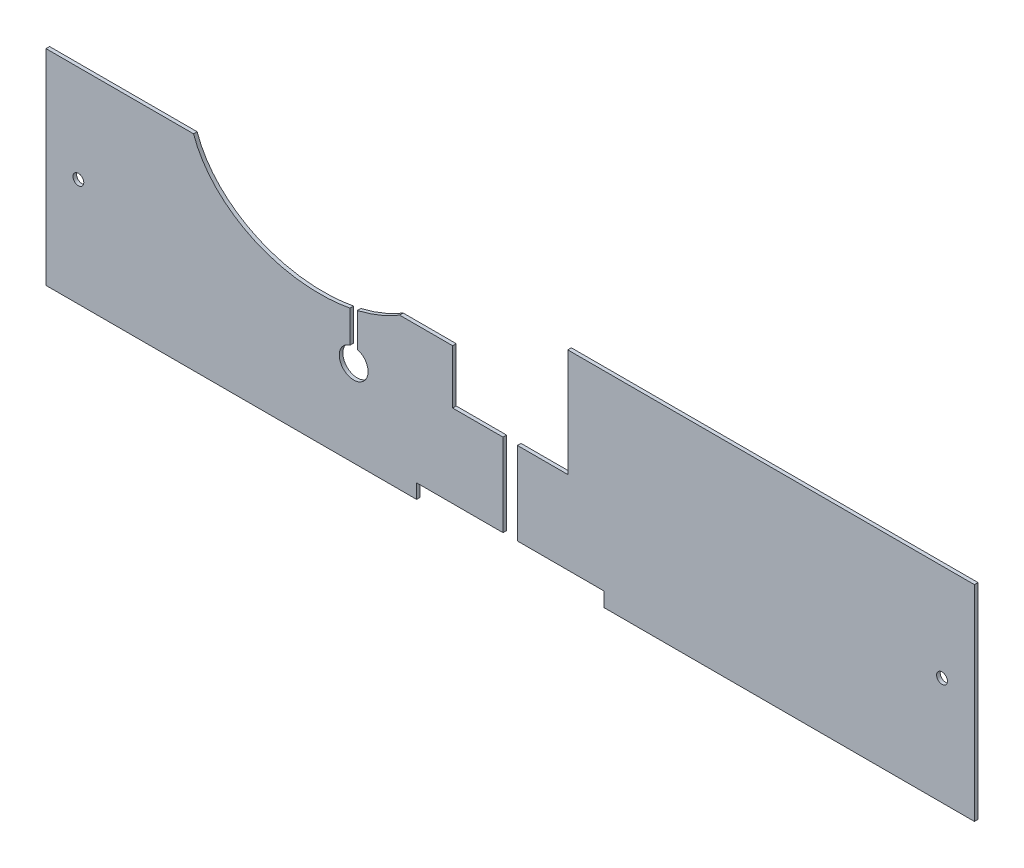
ISO-10303-21;
HEADER;
FILE_DESCRIPTION(('STEP AP214'),'2;1');
FILE_NAME('part.step','',(''),(''),'','','');
FILE_SCHEMA(('AUTOMOTIVE_DESIGN { 1 0 10303 214 1 1 1 1 }'));
ENDSEC;
DATA;
#1=APPLICATION_CONTEXT('core data for automotive mechanical design processes');
#2=APPLICATION_PROTOCOL_DEFINITION('international standard','automotive_design',2000,#1);
#3=PRODUCT_CONTEXT('',#1,'mechanical');
#4=PRODUCT('Part','Part','',(#3));
#5=PRODUCT_RELATED_PRODUCT_CATEGORY('part','',(#4));
#6=PRODUCT_DEFINITION_FORMATION('','',#4);
#7=PRODUCT_DEFINITION_CONTEXT('part definition',#1,'design');
#8=PRODUCT_DEFINITION('design','',#6,#7);
#9=PRODUCT_DEFINITION_SHAPE('','',#8);
#10=(LENGTH_UNIT() NAMED_UNIT(*) SI_UNIT(.MILLI.,.METRE.));
#11=(NAMED_UNIT(*) PLANE_ANGLE_UNIT() SI_UNIT($,.RADIAN.));
#12=(NAMED_UNIT(*) SI_UNIT($,.STERADIAN.) SOLID_ANGLE_UNIT());
#13=UNCERTAINTY_MEASURE_WITH_UNIT(LENGTH_MEASURE(1.E-05),#10,'distance_accuracy_value','');
#14=(GEOMETRIC_REPRESENTATION_CONTEXT(3) GLOBAL_UNCERTAINTY_ASSIGNED_CONTEXT((#13)) GLOBAL_UNIT_ASSIGNED_CONTEXT((#10,
#11,#12)) REPRESENTATION_CONTEXT('',''));
#15=CARTESIAN_POINT('',(0.,0.,0.));
#16=DIRECTION('',(0.,0.,1.));
#17=DIRECTION('',(1.,0.,0.));
#18=AXIS2_PLACEMENT_3D('',#15,#16,#17);
#19=CARTESIAN_POINT('',(-53.,7.5,-1.));
#20=DIRECTION('',(0.,0.,1.));
#21=DIRECTION('',(1.,0.,0.));
#22=AXIS2_PLACEMENT_3D('',#19,#20,#21);
#23=ELLIPSE('',#22,36.2787242517337,28.5);
#24=DIRECTION('',(0.,0.,-1.));
#25=VECTOR('',#24,1.);
#26=SURFACE_OF_LINEAR_EXTRUSION('',#23,#25);
#27=DIRECTION('',(0.,0.,-1.));
#28=VECTOR('',#27,1.);
#29=CARTESIAN_POINT('',(-44.5,-20.2067036756708,-1.));
#30=LINE('',#29,#28);
#31=CARTESIAN_POINT('',(-44.5,-20.2067036756708,-1.));
#32=VERTEX_POINT('',#31);
#33=CARTESIAN_POINT('',(-44.5,-20.2067036756708,0.));
#34=VERTEX_POINT('',#33);
#35=EDGE_CURVE('E392',#32,#34,#30,.F.);
#36=ORIENTED_EDGE('',*,*,#35,.F.);
#37=CARTESIAN_POINT('',(-53.,7.5,-1.));
#38=DIRECTION('',(0.,0.,1.));
#39=DIRECTION('',(1.,0.,0.));
#40=AXIS2_PLACEMENT_3D('',#37,#38,#39);
#41=ELLIPSE('',#40,36.2787242517337,28.5);
#42=CARTESIAN_POINT('',(-88.,0.,-1.));
#43=VERTEX_POINT('',#42);
#44=EDGE_CURVE('E172',#43,#32,#41,.T.);
#45=ORIENTED_EDGE('',*,*,#44,.F.);
#46=DIRECTION('',(0.,0.,-1.));
#47=VECTOR('',#46,1.);
#48=CARTESIAN_POINT('',(-88.,0.,-1.));
#49=LINE('',#48,#47);
#50=CARTESIAN_POINT('',(-88.,0.,0.));
#51=VERTEX_POINT('',#50);
#52=EDGE_CURVE('E406',#43,#51,#49,.F.);
#53=ORIENTED_EDGE('',*,*,#52,.T.);
#54=CARTESIAN_POINT('',(-53.,7.5,0.));
#55=DIRECTION('',(0.,0.,1.));
#56=DIRECTION('',(1.,0.,0.));
#57=AXIS2_PLACEMENT_3D('',#54,#55,#56);
#58=ELLIPSE('',#57,36.2787242517337,28.5);
#59=EDGE_CURVE('E184',#51,#34,#58,.T.);
#60=ORIENTED_EDGE('',*,*,#59,.T.);
#61=EDGE_LOOP('',(#36,#45,#53,#60));
#62=FACE_BOUND('',#61,.T.);
#63=ADVANCED_FACE('F49',(#62),#26,.T.);
#64=CARTESIAN_POINT('',(-26.,-53.,-1.));
#65=DIRECTION('',(0.,-1.,0.));
#66=DIRECTION('',(0.,0.,-1.));
#67=AXIS2_PLACEMENT_3D('',#64,#65,#66);
#68=PLANE('',#67);
#69=DIRECTION('',(0.,0.,1.));
#70=VECTOR('',#69,1.);
#71=CARTESIAN_POINT('',(-1.99999999999999,-53.,-1.));
#72=LINE('',#71,#70);
#73=CARTESIAN_POINT('',(-1.99999999999999,-53.,-1.));
#74=VERTEX_POINT('',#73);
#75=CARTESIAN_POINT('',(-1.99999999999999,-53.,0.));
#76=VERTEX_POINT('',#75);
#77=EDGE_CURVE('E395',#74,#76,#72,.T.);
#78=ORIENTED_EDGE('',*,*,#77,.T.);
#79=DIRECTION('',(1.,0.,0.));
#80=VECTOR('',#79,1.);
#81=CARTESIAN_POINT('',(-26.,-53.,0.));
#82=LINE('',#81,#80);
#83=CARTESIAN_POINT('',(-26.,-53.,0.));
#84=VERTEX_POINT('',#83);
#85=EDGE_CURVE('E191',#84,#76,#82,.T.);
#86=ORIENTED_EDGE('',*,*,#85,.F.);
#87=DIRECTION('',(0.,0.,1.));
#88=VECTOR('',#87,1.);
#89=CARTESIAN_POINT('',(-26.,-53.,-1.));
#90=LINE('',#89,#88);
#91=CARTESIAN_POINT('',(-26.,-53.,-1.));
#92=VERTEX_POINT('',#91);
#93=EDGE_CURVE('E419',#92,#84,#90,.T.);
#94=ORIENTED_EDGE('',*,*,#93,.F.);
#95=DIRECTION('',(1.,0.,0.));
#96=VECTOR('',#95,1.);
#97=CARTESIAN_POINT('',(-26.,-53.,-1.));
#98=LINE('',#97,#96);
#99=EDGE_CURVE('E178',#92,#74,#98,.T.);
#100=ORIENTED_EDGE('',*,*,#99,.T.);
#101=EDGE_LOOP('',(#78,#86,#94,#100));
#102=FACE_BOUND('',#101,.T.);
#103=ADVANCED_FACE('F51',(#102),#68,.T.);
#104=CARTESIAN_POINT('',(0.,0.,-1.));
#105=DIRECTION('',(0.,0.,-1.));
#106=DIRECTION('',(-1.,0.,0.));
#107=AXIS2_PLACEMENT_3D('',#104,#105,#106);
#108=PLANE('',#107);
#109=DIRECTION('',(1.,0.,0.));
#110=VECTOR('',#109,1.);
#111=CARTESIAN_POINT('',(-16.,-15.,-1.));
#112=LINE('',#111,#110);
#113=CARTESIAN_POINT('',(-30.7326846401877,-15.,-1.));
#114=VERTEX_POINT('',#113);
#115=CARTESIAN_POINT('',(-16.,-15.,-1.));
#116=VERTEX_POINT('',#115);
#117=EDGE_CURVE('E148',#114,#116,#112,.T.);
#118=ORIENTED_EDGE('',*,*,#117,.T.);
#119=DIRECTION('',(0.,1.,0.));
#120=VECTOR('',#119,1.);
#121=CARTESIAN_POINT('',(-16.,0.,-1.));
#122=LINE('',#121,#120);
#123=CARTESIAN_POINT('',(-16.,-30.,-1.));
#124=VERTEX_POINT('',#123);
#125=EDGE_CURVE('E176',#116,#124,#122,.F.);
#126=ORIENTED_EDGE('',*,*,#125,.T.);
#127=DIRECTION('',(-1.,0.,0.));
#128=VECTOR('',#127,1.);
#129=CARTESIAN_POINT('',(0.,-30.,-1.));
#130=LINE('',#129,#128);
#131=CARTESIAN_POINT('',(-2.,-30.,-1.));
#132=VERTEX_POINT('',#131);
#133=EDGE_CURVE('E457',#124,#132,#130,.F.);
#134=ORIENTED_EDGE('',*,*,#133,.T.);
#135=DIRECTION('',(0.,-1.,0.));
#136=VECTOR('',#135,1.);
#137=CARTESIAN_POINT('',(-2.,0.,-1.));
#138=LINE('',#137,#136);
#139=EDGE_CURVE('E173',#132,#74,#138,.T.);
#140=ORIENTED_EDGE('',*,*,#139,.T.);
#141=ORIENTED_EDGE('',*,*,#99,.F.);
#142=DIRECTION('',(0.,1.,0.));
#143=VECTOR('',#142,1.);
#144=CARTESIAN_POINT('',(-26.,-57.,-1.));
#145=LINE('',#144,#143);
#146=CARTESIAN_POINT('',(-26.,-57.,-1.));
#147=VERTEX_POINT('',#146);
#148=EDGE_CURVE('E420',#147,#92,#145,.T.);
#149=ORIENTED_EDGE('',*,*,#148,.F.);
#150=DIRECTION('',(1.,0.,0.));
#151=VECTOR('',#150,1.);
#152=CARTESIAN_POINT('',(-129.,-57.,-1.));
#153=LINE('',#152,#151);
#154=CARTESIAN_POINT('',(-129.,-57.,-1.));
#155=VERTEX_POINT('',#154);
#156=EDGE_CURVE('E409',#155,#147,#153,.T.);
#157=ORIENTED_EDGE('',*,*,#156,.F.);
#158=DIRECTION('',(0.,-1.,0.));
#159=VECTOR('',#158,1.);
#160=CARTESIAN_POINT('',(-129.,-57.,-1.));
#161=LINE('',#160,#159);
#162=CARTESIAN_POINT('',(-129.,0.,-1.));
#163=VERTEX_POINT('',#162);
#164=EDGE_CURVE('E412',#163,#155,#161,.T.);
#165=ORIENTED_EDGE('',*,*,#164,.F.);
#166=DIRECTION('',(-1.,0.,0.));
#167=VECTOR('',#166,1.);
#168=CARTESIAN_POINT('',(-129.,0.,-1.));
#169=LINE('',#168,#167);
#170=EDGE_CURVE('E436',#43,#163,#169,.T.);
#171=ORIENTED_EDGE('',*,*,#170,.F.);
#172=ORIENTED_EDGE('',*,*,#44,.T.);
#173=DIRECTION('',(0.,-1.,0.));
#174=VECTOR('',#173,1.);
#175=CARTESIAN_POINT('',(-44.5,-19.7802126091422,-1.));
#176=LINE('',#175,#174);
#177=CARTESIAN_POINT('',(-44.5,-29.1270166537926,-1.));
#178=VERTEX_POINT('',#177);
#179=EDGE_CURVE('E394',#32,#178,#176,.T.);
#180=ORIENTED_EDGE('',*,*,#179,.T.);
#181=CARTESIAN_POINT('',(-43.5,-33.,-1.));
#182=DIRECTION('',(0.,0.,1.));
#183=DIRECTION('',(-1.,0.,0.));
#184=AXIS2_PLACEMENT_3D('',#181,#182,#183);
#185=ELLIPSE('',#184,4.,4.);
#186=CARTESIAN_POINT('',(-42.5,-29.1270166537926,-1.));
#187=VERTEX_POINT('',#186);
#188=EDGE_CURVE('E192',#178,#187,#185,.T.);
#189=ORIENTED_EDGE('',*,*,#188,.T.);
#190=DIRECTION('',(0.,1.,0.));
#191=VECTOR('',#190,1.);
#192=CARTESIAN_POINT('',(-42.5,-19.7802126091422,-1.));
#193=LINE('',#192,#191);
#194=CARTESIAN_POINT('',(-42.5,-19.7802126091422,-1.));
#195=VERTEX_POINT('',#194);
#196=EDGE_CURVE('E63',#187,#195,#193,.T.);
#197=ORIENTED_EDGE('',*,*,#196,.T.);
#198=EDGE_CURVE('E165',#195,#114,#41,.T.);
#199=ORIENTED_EDGE('',*,*,#198,.T.);
#200=EDGE_LOOP('',(#118,#126,#134,#140,#141,#149,#157,#165,#171,#172,#180,#189,#197,#199));
#201=FACE_BOUND('',#200,.T.);
#202=CARTESIAN_POINT('',(-120.,-27.,-1.));
#203=DIRECTION('',(0.,0.,1.));
#204=DIRECTION('',(1.,0.,0.));
#205=AXIS2_PLACEMENT_3D('',#202,#203,#204);
#206=CIRCLE('',#205,1.5);
#207=CARTESIAN_POINT('',(-118.5,-27.,-1.));
#208=VERTEX_POINT('',#207);
#209=EDGE_CURVE('E188',#208,#208,#206,.T.);
#210=ORIENTED_EDGE('',*,*,#209,.T.);
#211=EDGE_LOOP('',(#210));
#212=FACE_BOUND('',#211,.T.);
#213=ADVANCED_FACE('F169',(#201,#212),#108,.T.);
#214=CARTESIAN_POINT('',(0.,0.,0.));
#215=DIRECTION('',(0.,0.,-1.));
#216=DIRECTION('',(-1.,0.,0.));
#217=AXIS2_PLACEMENT_3D('',#214,#215,#216);
#218=PLANE('',#217);
#219=DIRECTION('',(0.,-1.,0.));
#220=VECTOR('',#219,1.);
#221=CARTESIAN_POINT('',(-16.,0.,0.));
#222=LINE('',#221,#220);
#223=CARTESIAN_POINT('',(-16.,-15.,0.));
#224=VERTEX_POINT('',#223);
#225=CARTESIAN_POINT('',(-16.,-30.,0.));
#226=VERTEX_POINT('',#225);
#227=EDGE_CURVE('E448',#224,#226,#222,.T.);
#228=ORIENTED_EDGE('',*,*,#227,.F.);
#229=DIRECTION('',(1.,0.,0.));
#230=VECTOR('',#229,1.);
#231=CARTESIAN_POINT('',(-16.,-15.,0.));
#232=LINE('',#231,#230);
#233=CARTESIAN_POINT('',(-30.7326846401877,-15.,0.));
#234=VERTEX_POINT('',#233);
#235=EDGE_CURVE('E158',#234,#224,#232,.T.);
#236=ORIENTED_EDGE('',*,*,#235,.F.);
#237=CARTESIAN_POINT('',(-42.5,-19.7802126091422,0.));
#238=VERTEX_POINT('',#237);
#239=EDGE_CURVE('E167',#238,#234,#58,.T.);
#240=ORIENTED_EDGE('',*,*,#239,.F.);
#241=DIRECTION('',(0.,1.,0.));
#242=VECTOR('',#241,1.);
#243=CARTESIAN_POINT('',(-42.5,-19.7802126091422,0.));
#244=LINE('',#243,#242);
#245=CARTESIAN_POINT('',(-42.5,-29.1270166537926,0.));
#246=VERTEX_POINT('',#245);
#247=EDGE_CURVE('E403',#246,#238,#244,.T.);
#248=ORIENTED_EDGE('',*,*,#247,.F.);
#249=CARTESIAN_POINT('',(-43.5,-33.,0.));
#250=DIRECTION('',(0.,0.,1.));
#251=DIRECTION('',(-1.,0.,0.));
#252=AXIS2_PLACEMENT_3D('',#249,#250,#251);
#253=ELLIPSE('',#252,4.,4.);
#254=CARTESIAN_POINT('',(-44.5,-29.1270166537926,0.));
#255=VERTEX_POINT('',#254);
#256=EDGE_CURVE('E187',#255,#246,#253,.T.);
#257=ORIENTED_EDGE('',*,*,#256,.F.);
#258=DIRECTION('',(0.,-1.,0.));
#259=VECTOR('',#258,1.);
#260=CARTESIAN_POINT('',(-44.5,-19.7802126091422,0.));
#261=LINE('',#260,#259);
#262=EDGE_CURVE('E71',#34,#255,#261,.T.);
#263=ORIENTED_EDGE('',*,*,#262,.F.);
#264=ORIENTED_EDGE('',*,*,#59,.F.);
#265=DIRECTION('',(-1.,0.,0.));
#266=VECTOR('',#265,1.);
#267=CARTESIAN_POINT('',(-129.,0.,0.));
#268=LINE('',#267,#266);
#269=CARTESIAN_POINT('',(-129.,0.,0.));
#270=VERTEX_POINT('',#269);
#271=EDGE_CURVE('E427',#51,#270,#268,.T.);
#272=ORIENTED_EDGE('',*,*,#271,.T.);
#273=DIRECTION('',(0.,-1.,0.));
#274=VECTOR('',#273,1.);
#275=CARTESIAN_POINT('',(-129.,-57.,0.));
#276=LINE('',#275,#274);
#277=CARTESIAN_POINT('',(-129.,-57.,0.));
#278=VERTEX_POINT('',#277);
#279=EDGE_CURVE('E423',#270,#278,#276,.T.);
#280=ORIENTED_EDGE('',*,*,#279,.T.);
#281=DIRECTION('',(1.,0.,0.));
#282=VECTOR('',#281,1.);
#283=CARTESIAN_POINT('',(-129.,-57.,0.));
#284=LINE('',#283,#282);
#285=CARTESIAN_POINT('',(-26.,-57.,0.));
#286=VERTEX_POINT('',#285);
#287=EDGE_CURVE('E426',#278,#286,#284,.T.);
#288=ORIENTED_EDGE('',*,*,#287,.T.);
#289=DIRECTION('',(0.,1.,0.));
#290=VECTOR('',#289,1.);
#291=CARTESIAN_POINT('',(-26.,-57.,0.));
#292=LINE('',#291,#290);
#293=EDGE_CURVE('E430',#286,#84,#292,.T.);
#294=ORIENTED_EDGE('',*,*,#293,.T.);
#295=ORIENTED_EDGE('',*,*,#85,.T.);
#296=DIRECTION('',(0.,-1.,0.));
#297=VECTOR('',#296,1.);
#298=CARTESIAN_POINT('',(-2.,0.,0.));
#299=LINE('',#298,#297);
#300=CARTESIAN_POINT('',(-2.,-30.,0.));
#301=VERTEX_POINT('',#300);
#302=EDGE_CURVE('E439',#301,#76,#299,.T.);
#303=ORIENTED_EDGE('',*,*,#302,.F.);
#304=DIRECTION('',(1.,0.,0.));
#305=VECTOR('',#304,1.);
#306=CARTESIAN_POINT('',(16.,-30.,0.));
#307=LINE('',#306,#305);
#308=EDGE_CURVE('E433',#226,#301,#307,.T.);
#309=ORIENTED_EDGE('',*,*,#308,.F.);
#310=EDGE_LOOP('',(#228,#236,#240,#248,#257,#263,#264,#272,#280,#288,#294,#295,#303,#309));
#311=FACE_BOUND('',#310,.T.);
#312=CARTESIAN_POINT('',(-120.,-27.,0.));
#313=DIRECTION('',(0.,0.,1.));
#314=DIRECTION('',(1.,0.,0.));
#315=AXIS2_PLACEMENT_3D('',#312,#313,#314);
#316=CIRCLE('',#315,1.5);
#317=CARTESIAN_POINT('',(-118.5,-27.,0.));
#318=VERTEX_POINT('',#317);
#319=EDGE_CURVE('E193',#318,#318,#316,.T.);
#320=ORIENTED_EDGE('',*,*,#319,.F.);
#321=EDGE_LOOP('',(#320));
#322=FACE_BOUND('',#321,.T.);
#323=ADVANCED_FACE('F225',(#311,#322),#218,.F.);
#324=CARTESIAN_POINT('',(16.,-30.,0.));
#325=DIRECTION('',(0.,1.,0.));
#326=DIRECTION('',(1.,0.,0.));
#327=AXIS2_PLACEMENT_3D('',#324,#325,#326);
#328=PLANE('',#327);
#329=DIRECTION('',(0.,0.,1.));
#330=VECTOR('',#329,1.);
#331=CARTESIAN_POINT('',(-2.,-30.,0.));
#332=LINE('',#331,#330);
#333=EDGE_CURVE('E196',#132,#301,#332,.T.);
#334=ORIENTED_EDGE('',*,*,#333,.F.);
#335=ORIENTED_EDGE('',*,*,#133,.F.);
#336=DIRECTION('',(0.,0.,1.));
#337=VECTOR('',#336,1.);
#338=CARTESIAN_POINT('',(-16.,-30.,0.));
#339=LINE('',#338,#337);
#340=EDGE_CURVE('E197',#226,#124,#339,.F.);
#341=ORIENTED_EDGE('',*,*,#340,.F.);
#342=ORIENTED_EDGE('',*,*,#308,.T.);
#343=EDGE_LOOP('',(#334,#335,#341,#342));
#344=FACE_BOUND('',#343,.T.);
#345=ADVANCED_FACE('F221',(#344),#328,.T.);
#346=CARTESIAN_POINT('',(-129.,0.,-1.));
#347=DIRECTION('',(0.,1.,0.));
#348=DIRECTION('',(0.,0.,1.));
#349=AXIS2_PLACEMENT_3D('',#346,#347,#348);
#350=PLANE('',#349);
#351=ORIENTED_EDGE('',*,*,#271,.F.);
#352=ORIENTED_EDGE('',*,*,#52,.F.);
#353=ORIENTED_EDGE('',*,*,#170,.T.);
#354=DIRECTION('',(0.,0.,1.));
#355=VECTOR('',#354,1.);
#356=CARTESIAN_POINT('',(-129.,0.,-1.));
#357=LINE('',#356,#355);
#358=EDGE_CURVE('E416',#163,#270,#357,.T.);
#359=ORIENTED_EDGE('',*,*,#358,.T.);
#360=EDGE_LOOP('',(#351,#352,#353,#359));
#361=FACE_BOUND('',#360,.T.);
#362=ADVANCED_FACE('F217',(#361),#350,.T.);
#363=CARTESIAN_POINT('',(-129.,-57.,-1.));
#364=DIRECTION('',(-1.,0.,0.));
#365=DIRECTION('',(0.,0.,1.));
#366=AXIS2_PLACEMENT_3D('',#363,#364,#365);
#367=PLANE('',#366);
#368=ORIENTED_EDGE('',*,*,#279,.F.);
#369=ORIENTED_EDGE('',*,*,#358,.F.);
#370=ORIENTED_EDGE('',*,*,#164,.T.);
#371=DIRECTION('',(0.,0.,1.));
#372=VECTOR('',#371,1.);
#373=CARTESIAN_POINT('',(-129.,-57.,-1.));
#374=LINE('',#373,#372);
#375=EDGE_CURVE('E415',#155,#278,#374,.T.);
#376=ORIENTED_EDGE('',*,*,#375,.T.);
#377=EDGE_LOOP('',(#368,#369,#370,#376));
#378=FACE_BOUND('',#377,.T.);
#379=ADVANCED_FACE('F220',(#378),#367,.T.);
#380=CARTESIAN_POINT('',(-26.,-57.,-1.));
#381=DIRECTION('',(1.,0.,0.));
#382=DIRECTION('',(0.,0.,-1.));
#383=AXIS2_PLACEMENT_3D('',#380,#381,#382);
#384=PLANE('',#383);
#385=ORIENTED_EDGE('',*,*,#293,.F.);
#386=DIRECTION('',(0.,0.,1.));
#387=VECTOR('',#386,1.);
#388=CARTESIAN_POINT('',(-26.,-57.,-1.));
#389=LINE('',#388,#387);
#390=EDGE_CURVE('E408',#147,#286,#389,.T.);
#391=ORIENTED_EDGE('',*,*,#390,.F.);
#392=ORIENTED_EDGE('',*,*,#148,.T.);
#393=ORIENTED_EDGE('',*,*,#93,.T.);
#394=EDGE_LOOP('',(#385,#391,#392,#393));
#395=FACE_BOUND('',#394,.T.);
#396=ADVANCED_FACE('F245',(#395),#384,.T.);
#397=CARTESIAN_POINT('',(-129.,-57.,-1.));
#398=DIRECTION('',(0.,-1.,0.));
#399=DIRECTION('',(0.,0.,-1.));
#400=AXIS2_PLACEMENT_3D('',#397,#398,#399);
#401=PLANE('',#400);
#402=ORIENTED_EDGE('',*,*,#287,.F.);
#403=ORIENTED_EDGE('',*,*,#375,.F.);
#404=ORIENTED_EDGE('',*,*,#156,.T.);
#405=ORIENTED_EDGE('',*,*,#390,.T.);
#406=EDGE_LOOP('',(#402,#403,#404,#405));
#407=FACE_BOUND('',#406,.T.);
#408=ADVANCED_FACE('F241',(#407),#401,.T.);
#409=DIRECTION('',(0.,0.,1.));
#410=VECTOR('',#409,1.);
#411=CARTESIAN_POINT('',(-30.7326846401877,-15.,-1.));
#412=LINE('',#411,#410);
#413=EDGE_CURVE('E151',#114,#234,#412,.T.);
#414=ORIENTED_EDGE('',*,*,#413,.F.);
#415=ORIENTED_EDGE('',*,*,#198,.F.);
#416=DIRECTION('',(0.,0.,1.));
#417=VECTOR('',#416,1.);
#418=CARTESIAN_POINT('',(-42.5,-19.7802126091422,-1.));
#419=LINE('',#418,#417);
#420=EDGE_CURVE('E441',#195,#238,#419,.T.);
#421=ORIENTED_EDGE('',*,*,#420,.T.);
#422=ORIENTED_EDGE('',*,*,#239,.T.);
#423=EDGE_LOOP('',(#414,#415,#421,#422));
#424=FACE_BOUND('',#423,.T.);
#425=ADVANCED_FACE('F163',(#424),#26,.T.);
#426=CARTESIAN_POINT('',(-43.5,-33.,-1.));
#427=DIRECTION('',(0.,0.,1.));
#428=DIRECTION('',(-1.,0.,0.));
#429=AXIS2_PLACEMENT_3D('',#426,#427,#428);
#430=ELLIPSE('',#429,4.,4.);
#431=DIRECTION('',(0.,0.,-1.));
#432=VECTOR('',#431,1.);
#433=SURFACE_OF_LINEAR_EXTRUSION('',#430,#432);
#434=DIRECTION('',(0.,0.,-1.));
#435=VECTOR('',#434,1.);
#436=CARTESIAN_POINT('',(-42.5,-29.1270166537926,-1.));
#437=LINE('',#436,#435);
#438=EDGE_CURVE('E12',#187,#246,#437,.F.);
#439=ORIENTED_EDGE('',*,*,#438,.F.);
#440=ORIENTED_EDGE('',*,*,#188,.F.);
#441=DIRECTION('',(0.,0.,-1.));
#442=VECTOR('',#441,1.);
#443=CARTESIAN_POINT('',(-44.5,-29.1270166537926,-1.));
#444=LINE('',#443,#442);
#445=EDGE_CURVE('E57',#255,#178,#444,.T.);
#446=ORIENTED_EDGE('',*,*,#445,.F.);
#447=ORIENTED_EDGE('',*,*,#256,.T.);
#448=EDGE_LOOP('',(#439,#440,#446,#447));
#449=FACE_BOUND('',#448,.T.);
#450=ADVANCED_FACE('F202',(#449),#433,.T.);
#451=CARTESIAN_POINT('',(-16.,0.,0.));
#452=DIRECTION('',(1.,0.,0.));
#453=DIRECTION('',(0.,-1.,0.));
#454=AXIS2_PLACEMENT_3D('',#451,#452,#453);
#455=PLANE('',#454);
#456=DIRECTION('',(0.,0.,1.));
#457=VECTOR('',#456,1.);
#458=CARTESIAN_POINT('',(-16.,-15.,-1.));
#459=LINE('',#458,#457);
#460=EDGE_CURVE('E154',#116,#224,#459,.T.);
#461=ORIENTED_EDGE('',*,*,#460,.T.);
#462=ORIENTED_EDGE('',*,*,#227,.T.);
#463=ORIENTED_EDGE('',*,*,#340,.T.);
#464=ORIENTED_EDGE('',*,*,#125,.F.);
#465=EDGE_LOOP('',(#461,#462,#463,#464));
#466=FACE_BOUND('',#465,.T.);
#467=ADVANCED_FACE('F206',(#466),#455,.T.);
#468=CARTESIAN_POINT('',(-120.,-27.,-1.));
#469=DIRECTION('',(0.,0.,-1.));
#470=DIRECTION('',(-1.,0.,0.));
#471=AXIS2_PLACEMENT_3D('',#468,#469,#470);
#472=CYLINDRICAL_SURFACE('',#471,1.5);
#473=ORIENTED_EDGE('',*,*,#319,.T.);
#474=EDGE_LOOP('',(#473));
#475=FACE_BOUND('',#474,.T.);
#476=ORIENTED_EDGE('',*,*,#209,.F.);
#477=EDGE_LOOP('',(#476));
#478=FACE_BOUND('',#477,.T.);
#479=ADVANCED_FACE('F208',(#475,#478),#472,.F.);
#480=CARTESIAN_POINT('',(-2.,0.,-1.));
#481=DIRECTION('',(-1.,0.,0.));
#482=DIRECTION('',(0.,-1.,0.));
#483=AXIS2_PLACEMENT_3D('',#480,#481,#482);
#484=PLANE('',#483);
#485=ORIENTED_EDGE('',*,*,#333,.T.);
#486=ORIENTED_EDGE('',*,*,#302,.T.);
#487=ORIENTED_EDGE('',*,*,#77,.F.);
#488=ORIENTED_EDGE('',*,*,#139,.F.);
#489=EDGE_LOOP('',(#485,#486,#487,#488));
#490=FACE_BOUND('',#489,.T.);
#491=ADVANCED_FACE('F213',(#490),#484,.F.);
#492=CARTESIAN_POINT('',(-16.,-15.,-1.));
#493=DIRECTION('',(0.,-1.,0.));
#494=DIRECTION('',(1.,0.,0.));
#495=AXIS2_PLACEMENT_3D('',#492,#493,#494);
#496=PLANE('',#495);
#497=ORIENTED_EDGE('',*,*,#235,.T.);
#498=ORIENTED_EDGE('',*,*,#460,.F.);
#499=ORIENTED_EDGE('',*,*,#117,.F.);
#500=ORIENTED_EDGE('',*,*,#413,.T.);
#501=EDGE_LOOP('',(#497,#498,#499,#500));
#502=FACE_BOUND('',#501,.T.);
#503=ADVANCED_FACE('F150',(#502),#496,.F.);
#504=CARTESIAN_POINT('',(-44.5,-19.7802126091422,-1.));
#505=DIRECTION('',(-1.,0.,0.));
#506=DIRECTION('',(0.,0.,1.));
#507=AXIS2_PLACEMENT_3D('',#504,#505,#506);
#508=PLANE('',#507);
#509=ORIENTED_EDGE('',*,*,#35,.T.);
#510=ORIENTED_EDGE('',*,*,#262,.T.);
#511=ORIENTED_EDGE('',*,*,#445,.T.);
#512=ORIENTED_EDGE('',*,*,#179,.F.);
#513=EDGE_LOOP('',(#509,#510,#511,#512));
#514=FACE_BOUND('',#513,.T.);
#515=ADVANCED_FACE('F260',(#514),#508,.F.);
#516=CARTESIAN_POINT('',(-42.5,-19.7802126091422,-1.));
#517=DIRECTION('',(1.,0.,0.));
#518=DIRECTION('',(0.,1.,0.));
#519=AXIS2_PLACEMENT_3D('',#516,#517,#518);
#520=PLANE('',#519);
#521=ORIENTED_EDGE('',*,*,#438,.T.);
#522=ORIENTED_EDGE('',*,*,#247,.T.);
#523=ORIENTED_EDGE('',*,*,#420,.F.);
#524=ORIENTED_EDGE('',*,*,#196,.F.);
#525=EDGE_LOOP('',(#521,#522,#523,#524));
#526=FACE_BOUND('',#525,.T.);
#527=ADVANCED_FACE('F257',(#526),#520,.F.);
#528=CLOSED_SHELL('',(#63,#103,#213,#323,#345,#362,#379,#396,#408,#425,#450,#467,#479,#491,#503,
#515,#527));
#529=MANIFOLD_SOLID_BREP('B2',#528);
#530=CARTESIAN_POINT('',(-129.,0.,-1.));
#531=DIRECTION('',(0.,1.,0.));
#532=DIRECTION('',(0.,0.,1.));
#533=AXIS2_PLACEMENT_3D('',#530,#531,#532);
#534=PLANE('',#533);
#535=DIRECTION('',(-1.,0.,0.));
#536=VECTOR('',#535,1.);
#537=CARTESIAN_POINT('',(-129.,0.,-1.));
#538=LINE('',#537,#536);
#539=CARTESIAN_POINT('',(129.,0.,-1.));
#540=VERTEX_POINT('',#539);
#541=CARTESIAN_POINT('',(16.,0.,-1.));
#542=VERTEX_POINT('',#541);
#543=EDGE_CURVE('E584',#540,#542,#538,.T.);
#544=ORIENTED_EDGE('',*,*,#543,.T.);
#545=DIRECTION('',(0.,0.,1.));
#546=VECTOR('',#545,1.);
#547=CARTESIAN_POINT('',(16.,0.,0.));
#548=LINE('',#547,#546);
#549=CARTESIAN_POINT('',(16.,0.,0.));
#550=VERTEX_POINT('',#549);
#551=EDGE_CURVE('E616',#550,#542,#548,.F.);
#552=ORIENTED_EDGE('',*,*,#551,.F.);
#553=DIRECTION('',(-1.,0.,0.));
#554=VECTOR('',#553,1.);
#555=CARTESIAN_POINT('',(-129.,0.,0.));
#556=LINE('',#555,#554);
#557=CARTESIAN_POINT('',(129.,0.,0.));
#558=VERTEX_POINT('',#557);
#559=EDGE_CURVE('E568',#558,#550,#556,.T.);
#560=ORIENTED_EDGE('',*,*,#559,.F.);
#561=DIRECTION('',(0.,0.,1.));
#562=VECTOR('',#561,1.);
#563=CARTESIAN_POINT('',(129.,0.,-1.));
#564=LINE('',#563,#562);
#565=EDGE_CURVE('E491',#540,#558,#564,.T.);
#566=ORIENTED_EDGE('',*,*,#565,.F.);
#567=EDGE_LOOP('',(#544,#552,#560,#566));
#568=FACE_BOUND('',#567,.T.);
#569=ADVANCED_FACE('F483',(#568),#534,.T.);
#570=CARTESIAN_POINT('',(129.,-57.,-1.));
#571=DIRECTION('',(1.,0.,0.));
#572=DIRECTION('',(0.,0.,-1.));
#573=AXIS2_PLACEMENT_3D('',#570,#571,#572);
#574=PLANE('',#573);
#575=DIRECTION('',(0.,1.,0.));
#576=VECTOR('',#575,1.);
#577=CARTESIAN_POINT('',(129.,-57.,0.));
#578=LINE('',#577,#576);
#579=CARTESIAN_POINT('',(129.,-57.,0.));
#580=VERTEX_POINT('',#579);
#581=EDGE_CURVE('E573',#580,#558,#578,.T.);
#582=ORIENTED_EDGE('',*,*,#581,.F.);
#583=DIRECTION('',(0.,0.,1.));
#584=VECTOR('',#583,1.);
#585=CARTESIAN_POINT('',(129.,-57.,-1.));
#586=LINE('',#585,#584);
#587=CARTESIAN_POINT('',(129.,-57.,-1.));
#588=VERTEX_POINT('',#587);
#589=EDGE_CURVE('E599',#588,#580,#586,.T.);
#590=ORIENTED_EDGE('',*,*,#589,.F.);
#591=DIRECTION('',(0.,1.,0.));
#592=VECTOR('',#591,1.);
#593=CARTESIAN_POINT('',(129.,-57.,-1.));
#594=LINE('',#593,#592);
#595=EDGE_CURVE('E581',#588,#540,#594,.T.);
#596=ORIENTED_EDGE('',*,*,#595,.T.);
#597=ORIENTED_EDGE('',*,*,#565,.T.);
#598=EDGE_LOOP('',(#582,#590,#596,#597));
#599=FACE_BOUND('',#598,.T.);
#600=ADVANCED_FACE('F642',(#599),#574,.T.);
#601=CARTESIAN_POINT('',(26.,-57.,-1.));
#602=DIRECTION('',(0.,-1.,0.));
#603=DIRECTION('',(0.,0.,-1.));
#604=AXIS2_PLACEMENT_3D('',#601,#602,#603);
#605=PLANE('',#604);
#606=DIRECTION('',(1.,0.,0.));
#607=VECTOR('',#606,1.);
#608=CARTESIAN_POINT('',(26.,-57.,0.));
#609=LINE('',#608,#607);
#610=CARTESIAN_POINT('',(26.,-57.,0.));
#611=VERTEX_POINT('',#610);
#612=EDGE_CURVE('E593',#611,#580,#609,.T.);
#613=ORIENTED_EDGE('',*,*,#612,.F.);
#614=DIRECTION('',(0.,0.,1.));
#615=VECTOR('',#614,1.);
#616=CARTESIAN_POINT('',(26.,-57.,-1.));
#617=LINE('',#616,#615);
#618=CARTESIAN_POINT('',(26.,-57.,-1.));
#619=VERTEX_POINT('',#618);
#620=EDGE_CURVE('E601',#619,#611,#617,.T.);
#621=ORIENTED_EDGE('',*,*,#620,.F.);
#622=DIRECTION('',(1.,0.,0.));
#623=VECTOR('',#622,1.);
#624=CARTESIAN_POINT('',(26.,-57.,-1.));
#625=LINE('',#624,#623);
#626=EDGE_CURVE('E570',#619,#588,#625,.T.);
#627=ORIENTED_EDGE('',*,*,#626,.T.);
#628=ORIENTED_EDGE('',*,*,#589,.T.);
#629=EDGE_LOOP('',(#613,#621,#627,#628));
#630=FACE_BOUND('',#629,.T.);
#631=ADVANCED_FACE('F638',(#630),#605,.T.);
#632=CARTESIAN_POINT('',(26.,-57.,-1.));
#633=DIRECTION('',(-1.,0.,0.));
#634=DIRECTION('',(0.,0.,1.));
#635=AXIS2_PLACEMENT_3D('',#632,#633,#634);
#636=PLANE('',#635);
#637=DIRECTION('',(0.,-1.,0.));
#638=VECTOR('',#637,1.);
#639=CARTESIAN_POINT('',(26.,-57.,0.));
#640=LINE('',#639,#638);
#641=CARTESIAN_POINT('',(26.,-53.,0.));
#642=VERTEX_POINT('',#641);
#643=EDGE_CURVE('E589',#642,#611,#640,.T.);
#644=ORIENTED_EDGE('',*,*,#643,.F.);
#645=DIRECTION('',(0.,0.,1.));
#646=VECTOR('',#645,1.);
#647=CARTESIAN_POINT('',(26.,-53.,-1.));
#648=LINE('',#647,#646);
#649=CARTESIAN_POINT('',(26.,-53.,-1.));
#650=VERTEX_POINT('',#649);
#651=EDGE_CURVE('E587',#650,#642,#648,.T.);
#652=ORIENTED_EDGE('',*,*,#651,.F.);
#653=DIRECTION('',(0.,-1.,0.));
#654=VECTOR('',#653,1.);
#655=CARTESIAN_POINT('',(26.,-57.,-1.));
#656=LINE('',#655,#654);
#657=EDGE_CURVE('E567',#650,#619,#656,.T.);
#658=ORIENTED_EDGE('',*,*,#657,.T.);
#659=ORIENTED_EDGE('',*,*,#620,.T.);
#660=EDGE_LOOP('',(#644,#652,#658,#659));
#661=FACE_BOUND('',#660,.T.);
#662=ADVANCED_FACE('F604',(#661),#636,.T.);
#663=CARTESIAN_POINT('',(120.,-27.,-1.));
#664=DIRECTION('',(0.,0.,-1.));
#665=DIRECTION('',(-1.,0.,0.));
#666=AXIS2_PLACEMENT_3D('',#663,#664,#665);
#667=CYLINDRICAL_SURFACE('',#666,1.5);
#668=CARTESIAN_POINT('',(120.,-27.,0.));
#669=DIRECTION('',(0.,0.,1.));
#670=DIRECTION('',(1.,0.,0.));
#671=AXIS2_PLACEMENT_3D('',#668,#669,#670);
#672=CIRCLE('',#671,1.5);
#673=CARTESIAN_POINT('',(121.5,-27.,0.));
#674=VERTEX_POINT('',#673);
#675=EDGE_CURVE('E590',#674,#674,#672,.T.);
#676=ORIENTED_EDGE('',*,*,#675,.T.);
#677=EDGE_LOOP('',(#676));
#678=FACE_BOUND('',#677,.T.);
#679=CARTESIAN_POINT('',(120.,-27.,-1.));
#680=DIRECTION('',(0.,0.,1.));
#681=DIRECTION('',(-1.,0.,0.));
#682=AXIS2_PLACEMENT_3D('',#679,#680,#681);
#683=CIRCLE('',#682,1.5);
#684=CARTESIAN_POINT('',(118.5,-27.,-1.));
#685=VERTEX_POINT('',#684);
#686=EDGE_CURVE('E576',#685,#685,#683,.T.);
#687=ORIENTED_EDGE('',*,*,#686,.F.);
#688=EDGE_LOOP('',(#687));
#689=FACE_BOUND('',#688,.T.);
#690=ADVANCED_FACE('F627',(#678,#689),#667,.F.);
#691=CARTESIAN_POINT('',(16.,0.,0.));
#692=DIRECTION('',(-1.,0.,0.));
#693=DIRECTION('',(0.,1.,0.));
#694=AXIS2_PLACEMENT_3D('',#691,#692,#693);
#695=PLANE('',#694);
#696=DIRECTION('',(0.,0.,1.));
#697=VECTOR('',#696,1.);
#698=CARTESIAN_POINT('',(16.,-30.,0.));
#699=LINE('',#698,#697);
#700=CARTESIAN_POINT('',(16.,-30.,0.));
#701=VERTEX_POINT('',#700);
#702=CARTESIAN_POINT('',(16.,-30.,-1.));
#703=VERTEX_POINT('',#702);
#704=EDGE_CURVE('E619',#701,#703,#699,.F.);
#705=ORIENTED_EDGE('',*,*,#704,.F.);
#706=DIRECTION('',(0.,1.,0.));
#707=VECTOR('',#706,1.);
#708=CARTESIAN_POINT('',(16.,0.,0.));
#709=LINE('',#708,#707);
#710=EDGE_CURVE('E560',#701,#550,#709,.T.);
#711=ORIENTED_EDGE('',*,*,#710,.T.);
#712=ORIENTED_EDGE('',*,*,#551,.T.);
#713=DIRECTION('',(0.,1.,0.));
#714=VECTOR('',#713,1.);
#715=CARTESIAN_POINT('',(16.,0.,-1.));
#716=LINE('',#715,#714);
#717=EDGE_CURVE('E611',#703,#542,#716,.T.);
#718=ORIENTED_EDGE('',*,*,#717,.F.);
#719=EDGE_LOOP('',(#705,#711,#712,#718));
#720=FACE_BOUND('',#719,.T.);
#721=ADVANCED_FACE('F629',(#720),#695,.T.);
#722=CARTESIAN_POINT('',(16.,-30.,0.));
#723=DIRECTION('',(0.,1.,0.));
#724=DIRECTION('',(1.,0.,0.));
#725=AXIS2_PLACEMENT_3D('',#722,#723,#724);
#726=PLANE('',#725);
#727=DIRECTION('',(0.,0.,-1.));
#728=VECTOR('',#727,1.);
#729=CARTESIAN_POINT('',(2.,-30.,0.));
#730=LINE('',#729,#728);
#731=CARTESIAN_POINT('',(2.,-30.,0.));
#732=VERTEX_POINT('',#731);
#733=CARTESIAN_POINT('',(2.,-30.,-1.));
#734=VERTEX_POINT('',#733);
#735=EDGE_CURVE('E47',#732,#734,#730,.T.);
#736=ORIENTED_EDGE('',*,*,#735,.F.);
#737=DIRECTION('',(1.,0.,0.));
#738=VECTOR('',#737,1.);
#739=CARTESIAN_POINT('',(16.,-30.,0.));
#740=LINE('',#739,#738);
#741=EDGE_CURVE('E504',#732,#701,#740,.T.);
#742=ORIENTED_EDGE('',*,*,#741,.T.);
#743=ORIENTED_EDGE('',*,*,#704,.T.);
#744=DIRECTION('',(-1.,0.,0.));
#745=VECTOR('',#744,1.);
#746=CARTESIAN_POINT('',(0.,-30.,-1.));
#747=LINE('',#746,#745);
#748=EDGE_CURVE('E614',#734,#703,#747,.F.);
#749=ORIENTED_EDGE('',*,*,#748,.F.);
#750=EDGE_LOOP('',(#736,#742,#743,#749));
#751=FACE_BOUND('',#750,.T.);
#752=ADVANCED_FACE('F635',(#751),#726,.T.);
#753=CARTESIAN_POINT('',(0.,0.,0.));
#754=DIRECTION('',(0.,0.,-1.));
#755=DIRECTION('',(-1.,0.,0.));
#756=AXIS2_PLACEMENT_3D('',#753,#754,#755);
#757=PLANE('',#756);
#758=ORIENTED_EDGE('',*,*,#675,.F.);
#759=EDGE_LOOP('',(#758));
#760=FACE_BOUND('',#759,.T.);
#761=ORIENTED_EDGE('',*,*,#741,.F.);
#762=DIRECTION('',(0.,1.,0.));
#763=VECTOR('',#762,1.);
#764=CARTESIAN_POINT('',(2.,0.,0.));
#765=LINE('',#764,#763);
#766=CARTESIAN_POINT('',(1.99999999999999,-53.,0.));
#767=VERTEX_POINT('',#766);
#768=EDGE_CURVE('E497',#767,#732,#765,.T.);
#769=ORIENTED_EDGE('',*,*,#768,.F.);
#770=DIRECTION('',(1.,0.,0.));
#771=VECTOR('',#770,1.);
#772=CARTESIAN_POINT('',(-26.,-53.,0.));
#773=LINE('',#772,#771);
#774=EDGE_CURVE('E559',#767,#642,#773,.T.);
#775=ORIENTED_EDGE('',*,*,#774,.T.);
#776=ORIENTED_EDGE('',*,*,#643,.T.);
#777=ORIENTED_EDGE('',*,*,#612,.T.);
#778=ORIENTED_EDGE('',*,*,#581,.T.);
#779=ORIENTED_EDGE('',*,*,#559,.T.);
#780=ORIENTED_EDGE('',*,*,#710,.F.);
#781=EDGE_LOOP('',(#761,#769,#775,#776,#777,#778,#779,#780));
#782=FACE_BOUND('',#781,.T.);
#783=ADVANCED_FACE('F607',(#760,#782),#757,.F.);
#784=CARTESIAN_POINT('',(0.,0.,-1.));
#785=DIRECTION('',(0.,0.,-1.));
#786=DIRECTION('',(-1.,0.,0.));
#787=AXIS2_PLACEMENT_3D('',#784,#785,#786);
#788=PLANE('',#787);
#789=DIRECTION('',(0.,1.,0.));
#790=VECTOR('',#789,1.);
#791=CARTESIAN_POINT('',(2.,0.,-1.));
#792=LINE('',#791,#790);
#793=CARTESIAN_POINT('',(1.99999999999999,-53.,-1.));
#794=VERTEX_POINT('',#793);
#795=EDGE_CURVE('E546',#794,#734,#792,.T.);
#796=ORIENTED_EDGE('',*,*,#795,.T.);
#797=ORIENTED_EDGE('',*,*,#748,.T.);
#798=ORIENTED_EDGE('',*,*,#717,.T.);
#799=ORIENTED_EDGE('',*,*,#543,.F.);
#800=ORIENTED_EDGE('',*,*,#595,.F.);
#801=ORIENTED_EDGE('',*,*,#626,.F.);
#802=ORIENTED_EDGE('',*,*,#657,.F.);
#803=DIRECTION('',(1.,0.,0.));
#804=VECTOR('',#803,1.);
#805=CARTESIAN_POINT('',(-26.,-53.,-1.));
#806=LINE('',#805,#804);
#807=EDGE_CURVE('E557',#794,#650,#806,.T.);
#808=ORIENTED_EDGE('',*,*,#807,.F.);
#809=EDGE_LOOP('',(#796,#797,#798,#799,#800,#801,#802,#808));
#810=FACE_BOUND('',#809,.T.);
#811=ORIENTED_EDGE('',*,*,#686,.T.);
#812=EDGE_LOOP('',(#811));
#813=FACE_BOUND('',#812,.T.);
#814=ADVANCED_FACE('F563',(#810,#813),#788,.T.);
#815=CARTESIAN_POINT('',(-26.,-53.,-1.));
#816=DIRECTION('',(0.,-1.,0.));
#817=DIRECTION('',(0.,0.,-1.));
#818=AXIS2_PLACEMENT_3D('',#815,#816,#817);
#819=PLANE('',#818);
#820=DIRECTION('',(0.,0.,1.));
#821=VECTOR('',#820,1.);
#822=CARTESIAN_POINT('',(1.99999999999999,-53.,-1.));
#823=LINE('',#822,#821);
#824=EDGE_CURVE('E549',#794,#767,#823,.T.);
#825=ORIENTED_EDGE('',*,*,#824,.F.);
#826=ORIENTED_EDGE('',*,*,#807,.T.);
#827=ORIENTED_EDGE('',*,*,#651,.T.);
#828=ORIENTED_EDGE('',*,*,#774,.F.);
#829=EDGE_LOOP('',(#825,#826,#827,#828));
#830=FACE_BOUND('',#829,.T.);
#831=ADVANCED_FACE('F485',(#830),#819,.T.);
#832=CARTESIAN_POINT('',(2.,0.,-1.));
#833=DIRECTION('',(1.,0.,0.));
#834=DIRECTION('',(0.,1.,0.));
#835=AXIS2_PLACEMENT_3D('',#832,#833,#834);
#836=PLANE('',#835);
#837=ORIENTED_EDGE('',*,*,#735,.T.);
#838=ORIENTED_EDGE('',*,*,#795,.F.);
#839=ORIENTED_EDGE('',*,*,#824,.T.);
#840=ORIENTED_EDGE('',*,*,#768,.T.);
#841=EDGE_LOOP('',(#837,#838,#839,#840));
#842=FACE_BOUND('',#841,.T.);
#843=ADVANCED_FACE('F548',(#842),#836,.F.);
#844=CLOSED_SHELL('',(#569,#600,#631,#662,#690,#721,#752,#783,#814,#831,#843));
#845=MANIFOLD_SOLID_BREP('B6',#844);
#846=ADVANCED_BREP_SHAPE_REPRESENTATION('',(#18,#529,#845),#14);
#847=SHAPE_DEFINITION_REPRESENTATION(#9,#846);
ENDSEC;
END-ISO-10303-21;
